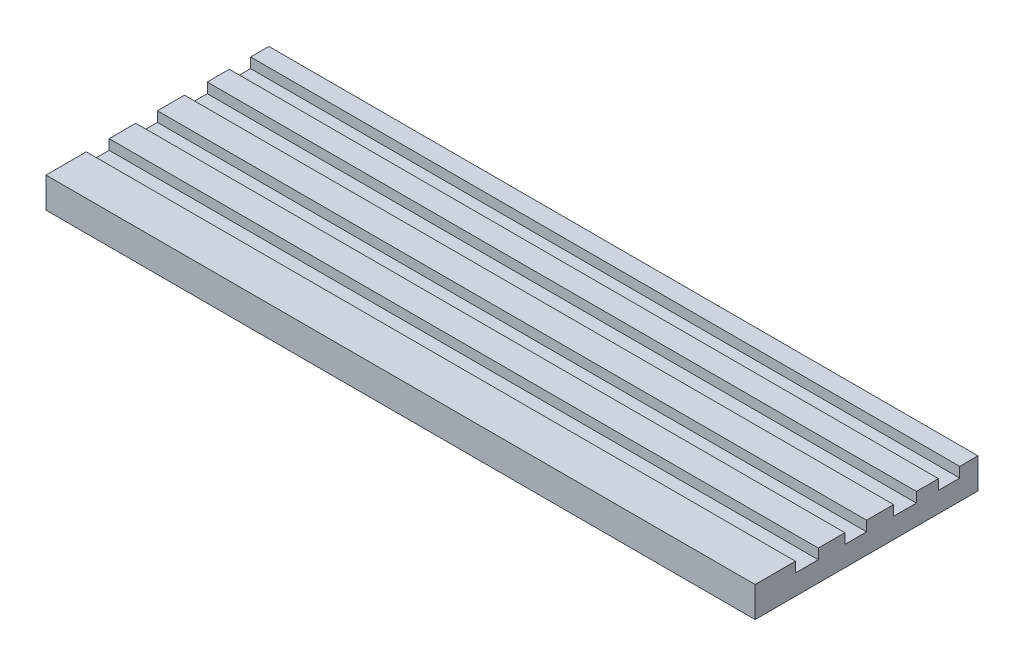
ISO-10303-21;
HEADER;
FILE_DESCRIPTION(('STEP AP214'),'2;1');
FILE_NAME('part.step','',(''),(''),'','','');
FILE_SCHEMA(('AUTOMOTIVE_DESIGN { 1 0 10303 214 1 1 1 1 }'));
ENDSEC;
DATA;
#1=APPLICATION_CONTEXT('core data for automotive mechanical design processes');
#2=APPLICATION_PROTOCOL_DEFINITION('international standard','automotive_design',2000,#1);
#3=PRODUCT_CONTEXT('',#1,'mechanical');
#4=PRODUCT('Part','Part','',(#3));
#5=PRODUCT_RELATED_PRODUCT_CATEGORY('part','',(#4));
#6=PRODUCT_DEFINITION_FORMATION('','',#4);
#7=PRODUCT_DEFINITION_CONTEXT('part definition',#1,'design');
#8=PRODUCT_DEFINITION('design','',#6,#7);
#9=PRODUCT_DEFINITION_SHAPE('','',#8);
#10=(LENGTH_UNIT() NAMED_UNIT(*) SI_UNIT(.MILLI.,.METRE.));
#11=(NAMED_UNIT(*) PLANE_ANGLE_UNIT() SI_UNIT($,.RADIAN.));
#12=(NAMED_UNIT(*) SI_UNIT($,.STERADIAN.) SOLID_ANGLE_UNIT());
#13=UNCERTAINTY_MEASURE_WITH_UNIT(LENGTH_MEASURE(1.E-05),#10,'distance_accuracy_value','');
#14=(GEOMETRIC_REPRESENTATION_CONTEXT(3) GLOBAL_UNCERTAINTY_ASSIGNED_CONTEXT((#13)) GLOBAL_UNIT_ASSIGNED_CONTEXT((#10,
#11,#12)) REPRESENTATION_CONTEXT('',''));
#15=CARTESIAN_POINT('',(0.,0.,0.));
#16=DIRECTION('',(0.,0.,1.));
#17=DIRECTION('',(1.,0.,0.));
#18=AXIS2_PLACEMENT_3D('',#15,#16,#17);
#19=CARTESIAN_POINT('',(0.,3.,0.));
#20=DIRECTION('',(0.,-1.,0.));
#21=DIRECTION('',(0.,0.,-1.));
#22=AXIS2_PLACEMENT_3D('',#19,#20,#21);
#23=PLANE('',#22);
#24=DIRECTION('',(0.,0.,1.));
#25=VECTOR('',#24,1.);
#26=CARTESIAN_POINT('',(0.,3.,0.));
#27=LINE('',#26,#25);
#28=CARTESIAN_POINT('',(0.,3.,-22.));
#29=VERTEX_POINT('',#28);
#30=CARTESIAN_POINT('',(0.,3.,-20.1975420590183));
#31=VERTEX_POINT('',#30);
#32=EDGE_CURVE('E293',#29,#31,#27,.T.);
#33=ORIENTED_EDGE('',*,*,#32,.T.);
#34=DIRECTION('',(-1.,0.,0.));
#35=VECTOR('',#34,1.);
#36=CARTESIAN_POINT('',(0.,3.,-20.1975420590183));
#37=LINE('',#36,#35);
#38=CARTESIAN_POINT('',(70.,3.,-20.1975420590183));
#39=VERTEX_POINT('',#38);
#40=EDGE_CURVE('E204',#39,#31,#37,.T.);
#41=ORIENTED_EDGE('',*,*,#40,.F.);
#42=DIRECTION('',(0.,0.,-1.));
#43=VECTOR('',#42,1.);
#44=CARTESIAN_POINT('',(70.,3.,0.));
#45=LINE('',#44,#43);
#46=CARTESIAN_POINT('',(70.,3.,-22.));
#47=VERTEX_POINT('',#46);
#48=EDGE_CURVE('E299',#39,#47,#45,.T.);
#49=ORIENTED_EDGE('',*,*,#48,.T.);
#50=DIRECTION('',(-1.,0.,0.));
#51=VECTOR('',#50,1.);
#52=CARTESIAN_POINT('',(0.,3.,-22.));
#53=LINE('',#52,#51);
#54=EDGE_CURVE('E303',#47,#29,#53,.T.);
#55=ORIENTED_EDGE('',*,*,#54,.T.);
#56=EDGE_LOOP('',(#33,#41,#49,#55));
#57=FACE_BOUND('',#56,.T.);
#58=ADVANCED_FACE('F47',(#57),#23,.F.);
#59=CARTESIAN_POINT('',(70.,3.,-15.9178694274751));
#60=VERTEX_POINT('',#59);
#61=CARTESIAN_POINT('',(70.,3.,-18.0952467312427));
#62=VERTEX_POINT('',#61);
#63=EDGE_CURVE('E346',#60,#62,#45,.T.);
#64=ORIENTED_EDGE('',*,*,#63,.T.);
#65=DIRECTION('',(1.,0.,0.));
#66=VECTOR('',#65,1.);
#67=CARTESIAN_POINT('',(0.,3.,-18.0952467312427));
#68=LINE('',#67,#66);
#69=CARTESIAN_POINT('',(0.,3.,-18.0952467312427));
#70=VERTEX_POINT('',#69);
#71=EDGE_CURVE('E235',#70,#62,#68,.T.);
#72=ORIENTED_EDGE('',*,*,#71,.F.);
#73=CARTESIAN_POINT('',(0.,3.,-15.9178694274751));
#74=VERTEX_POINT('',#73);
#75=EDGE_CURVE('E209',#70,#74,#27,.T.);
#76=ORIENTED_EDGE('',*,*,#75,.T.);
#77=DIRECTION('',(-1.,0.,0.));
#78=VECTOR('',#77,1.);
#79=CARTESIAN_POINT('',(0.,3.,-15.9178694274751));
#80=LINE('',#79,#78);
#81=EDGE_CURVE('E228',#60,#74,#80,.T.);
#82=ORIENTED_EDGE('',*,*,#81,.F.);
#83=EDGE_LOOP('',(#64,#72,#76,#82));
#84=FACE_BOUND('',#83,.T.);
#85=ADVANCED_FACE('F389',(#84),#23,.F.);
#86=CARTESIAN_POINT('',(70.,3.,-11.));
#87=VERTEX_POINT('',#86);
#88=CARTESIAN_POINT('',(70.,3.,-13.6654101477155));
#89=VERTEX_POINT('',#88);
#90=EDGE_CURVE('E348',#87,#89,#45,.T.);
#91=ORIENTED_EDGE('',*,*,#90,.T.);
#92=DIRECTION('',(1.,0.,0.));
#93=VECTOR('',#92,1.);
#94=CARTESIAN_POINT('',(0.,3.,-13.6654101477155));
#95=LINE('',#94,#93);
#96=CARTESIAN_POINT('',(0.,3.,-13.6654101477155));
#97=VERTEX_POINT('',#96);
#98=EDGE_CURVE('E231',#97,#89,#95,.T.);
#99=ORIENTED_EDGE('',*,*,#98,.F.);
#100=CARTESIAN_POINT('',(0.,3.,-11.));
#101=VERTEX_POINT('',#100);
#102=EDGE_CURVE('E375',#97,#101,#27,.T.);
#103=ORIENTED_EDGE('',*,*,#102,.T.);
#104=DIRECTION('',(-1.,0.,0.));
#105=VECTOR('',#104,1.);
#106=CARTESIAN_POINT('',(0.,3.,-11.));
#107=LINE('',#106,#105);
#108=EDGE_CURVE('E257',#87,#101,#107,.T.);
#109=ORIENTED_EDGE('',*,*,#108,.F.);
#110=EDGE_LOOP('',(#91,#99,#103,#109));
#111=FACE_BOUND('',#110,.T.);
#112=ADVANCED_FACE('F395',(#111),#23,.F.);
#113=CARTESIAN_POINT('',(70.,3.,-6.23229452450888));
#114=VERTEX_POINT('',#113);
#115=CARTESIAN_POINT('',(70.,3.,-8.8601636842284));
#116=VERTEX_POINT('',#115);
#117=EDGE_CURVE('E304',#114,#116,#45,.T.);
#118=ORIENTED_EDGE('',*,*,#117,.T.);
#119=DIRECTION('',(1.,0.,0.));
#120=VECTOR('',#119,1.);
#121=CARTESIAN_POINT('',(0.,3.,-8.8601636842284));
#122=LINE('',#121,#120);
#123=CARTESIAN_POINT('',(0.,3.,-8.8601636842284));
#124=VERTEX_POINT('',#123);
#125=EDGE_CURVE('E227',#124,#116,#122,.T.);
#126=ORIENTED_EDGE('',*,*,#125,.F.);
#127=CARTESIAN_POINT('',(0.,3.,-6.23229452450888));
#128=VERTEX_POINT('',#127);
#129=EDGE_CURVE('E373',#124,#128,#27,.T.);
#130=ORIENTED_EDGE('',*,*,#129,.T.);
#131=DIRECTION('',(-1.,0.,0.));
#132=VECTOR('',#131,1.);
#133=CARTESIAN_POINT('',(0.,3.,-6.23229452450888));
#134=LINE('',#133,#132);
#135=EDGE_CURVE('E280',#114,#128,#134,.T.);
#136=ORIENTED_EDGE('',*,*,#135,.F.);
#137=EDGE_LOOP('',(#118,#126,#130,#136));
#138=FACE_BOUND('',#137,.T.);
#139=ADVANCED_FACE('F361',(#138),#23,.F.);
#140=CARTESIAN_POINT('',(0.,3.,0.));
#141=DIRECTION('',(1.,0.,0.));
#142=DIRECTION('',(0.,0.,-1.));
#143=AXIS2_PLACEMENT_3D('',#140,#141,#142);
#144=PLANE('',#143);
#145=DIRECTION('',(0.,0.,1.));
#146=VECTOR('',#145,1.);
#147=CARTESIAN_POINT('',(0.,2.,-20.1975420590183));
#148=LINE('',#147,#146);
#149=CARTESIAN_POINT('',(0.,2.,-20.1975420590183));
#150=VERTEX_POINT('',#149);
#151=CARTESIAN_POINT('',(0.,2.,-18.0952467312427));
#152=VERTEX_POINT('',#151);
#153=EDGE_CURVE('E195',#150,#152,#148,.T.);
#154=ORIENTED_EDGE('',*,*,#153,.F.);
#155=DIRECTION('',(0.,1.,0.));
#156=VECTOR('',#155,1.);
#157=CARTESIAN_POINT('',(0.,2.,-20.1975420590183));
#158=LINE('',#157,#156);
#159=EDGE_CURVE('E312',#150,#31,#158,.T.);
#160=ORIENTED_EDGE('',*,*,#159,.T.);
#161=ORIENTED_EDGE('',*,*,#32,.F.);
#162=DIRECTION('',(0.,-1.,0.));
#163=VECTOR('',#162,1.);
#164=CARTESIAN_POINT('',(0.,3.,-22.));
#165=LINE('',#164,#163);
#166=CARTESIAN_POINT('',(0.,0.,-22.));
#167=VERTEX_POINT('',#166);
#168=EDGE_CURVE('E307',#29,#167,#165,.T.);
#169=ORIENTED_EDGE('',*,*,#168,.T.);
#170=DIRECTION('',(0.,0.,1.));
#171=VECTOR('',#170,1.);
#172=CARTESIAN_POINT('',(0.,0.,0.));
#173=LINE('',#172,#171);
#174=CARTESIAN_POINT('',(0.,0.,0.));
#175=VERTEX_POINT('',#174);
#176=EDGE_CURVE('E308',#167,#175,#173,.T.);
#177=ORIENTED_EDGE('',*,*,#176,.T.);
#178=DIRECTION('',(0.,-1.,0.));
#179=VECTOR('',#178,1.);
#180=CARTESIAN_POINT('',(0.,3.,0.));
#181=LINE('',#180,#179);
#182=CARTESIAN_POINT('',(0.,3.,0.));
#183=VERTEX_POINT('',#182);
#184=EDGE_CURVE('E11',#183,#175,#181,.T.);
#185=ORIENTED_EDGE('',*,*,#184,.F.);
#186=CARTESIAN_POINT('',(0.,3.,-3.9798352447493));
#187=VERTEX_POINT('',#186);
#188=EDGE_CURVE('E297',#187,#183,#27,.T.);
#189=ORIENTED_EDGE('',*,*,#188,.F.);
#190=DIRECTION('',(0.,1.,0.));
#191=VECTOR('',#190,1.);
#192=CARTESIAN_POINT('',(0.,2.,-3.9798352447493));
#193=LINE('',#192,#191);
#194=CARTESIAN_POINT('',(0.,2.,-3.9798352447493));
#195=VERTEX_POINT('',#194);
#196=EDGE_CURVE('E62',#195,#187,#193,.T.);
#197=ORIENTED_EDGE('',*,*,#196,.F.);
#198=DIRECTION('',(0.,0.,1.));
#199=VECTOR('',#198,1.);
#200=CARTESIAN_POINT('',(0.,2.,-6.23229452450888));
#201=LINE('',#200,#199);
#202=CARTESIAN_POINT('',(0.,2.,-6.23229452450888));
#203=VERTEX_POINT('',#202);
#204=EDGE_CURVE('E282',#203,#195,#201,.T.);
#205=ORIENTED_EDGE('',*,*,#204,.F.);
#206=DIRECTION('',(0.,1.,0.));
#207=VECTOR('',#206,1.);
#208=CARTESIAN_POINT('',(0.,2.,-6.23229452450888));
#209=LINE('',#208,#207);
#210=EDGE_CURVE('E277',#203,#128,#209,.T.);
#211=ORIENTED_EDGE('',*,*,#210,.T.);
#212=ORIENTED_EDGE('',*,*,#129,.F.);
#213=DIRECTION('',(0.,1.,0.));
#214=VECTOR('',#213,1.);
#215=CARTESIAN_POINT('',(0.,2.,-8.8601636842284));
#216=LINE('',#215,#214);
#217=CARTESIAN_POINT('',(0.,2.,-8.8601636842284));
#218=VERTEX_POINT('',#217);
#219=EDGE_CURVE('E70',#218,#124,#216,.T.);
#220=ORIENTED_EDGE('',*,*,#219,.F.);
#221=DIRECTION('',(0.,0.,1.));
#222=VECTOR('',#221,1.);
#223=CARTESIAN_POINT('',(0.,2.,-11.));
#224=LINE('',#223,#222);
#225=CARTESIAN_POINT('',(0.,2.,-11.));
#226=VERTEX_POINT('',#225);
#227=EDGE_CURVE('E259',#226,#218,#224,.T.);
#228=ORIENTED_EDGE('',*,*,#227,.F.);
#229=DIRECTION('',(0.,1.,0.));
#230=VECTOR('',#229,1.);
#231=CARTESIAN_POINT('',(0.,2.,-11.));
#232=LINE('',#231,#230);
#233=EDGE_CURVE('E253',#226,#101,#232,.T.);
#234=ORIENTED_EDGE('',*,*,#233,.T.);
#235=ORIENTED_EDGE('',*,*,#102,.F.);
#236=DIRECTION('',(0.,1.,0.));
#237=VECTOR('',#236,1.);
#238=CARTESIAN_POINT('',(0.,2.,-13.6654101477155));
#239=LINE('',#238,#237);
#240=CARTESIAN_POINT('',(0.,2.,-13.6654101477155));
#241=VERTEX_POINT('',#240);
#242=EDGE_CURVE('E217',#241,#97,#239,.T.);
#243=ORIENTED_EDGE('',*,*,#242,.F.);
#244=DIRECTION('',(0.,0.,1.));
#245=VECTOR('',#244,1.);
#246=CARTESIAN_POINT('',(0.,2.,-15.9178694274751));
#247=LINE('',#246,#245);
#248=CARTESIAN_POINT('',(0.,2.,-15.9178694274751));
#249=VERTEX_POINT('',#248);
#250=EDGE_CURVE('E232',#249,#241,#247,.T.);
#251=ORIENTED_EDGE('',*,*,#250,.F.);
#252=DIRECTION('',(0.,1.,0.));
#253=VECTOR('',#252,1.);
#254=CARTESIAN_POINT('',(0.,2.,-15.9178694274751));
#255=LINE('',#254,#253);
#256=EDGE_CURVE('E225',#249,#74,#255,.T.);
#257=ORIENTED_EDGE('',*,*,#256,.T.);
#258=ORIENTED_EDGE('',*,*,#75,.F.);
#259=DIRECTION('',(0.,1.,0.));
#260=VECTOR('',#259,1.);
#261=CARTESIAN_POINT('',(0.,2.,-18.0952467312427));
#262=LINE('',#261,#260);
#263=EDGE_CURVE('E187',#152,#70,#262,.T.);
#264=ORIENTED_EDGE('',*,*,#263,.F.);
#265=EDGE_LOOP('',(#154,#160,#161,#169,#177,#185,#189,#197,#205,#211,#212,#220,#228,#234,#235,
#243,#251,#257,#258,#264));
#266=FACE_BOUND('',#265,.T.);
#267=ADVANCED_FACE('F49',(#266),#144,.F.);
#268=CARTESIAN_POINT('',(0.,3.,0.));
#269=DIRECTION('',(0.,0.,-1.));
#270=DIRECTION('',(-1.,0.,0.));
#271=AXIS2_PLACEMENT_3D('',#268,#269,#270);
#272=PLANE('',#271);
#273=DIRECTION('',(1.,0.,0.));
#274=VECTOR('',#273,1.);
#275=CARTESIAN_POINT('',(0.,0.,0.));
#276=LINE('',#275,#274);
#277=CARTESIAN_POINT('',(70.,0.,0.));
#278=VERTEX_POINT('',#277);
#279=EDGE_CURVE('E311',#175,#278,#276,.T.);
#280=ORIENTED_EDGE('',*,*,#279,.T.);
#281=DIRECTION('',(0.,-1.,0.));
#282=VECTOR('',#281,1.);
#283=CARTESIAN_POINT('',(70.,3.,0.));
#284=LINE('',#283,#282);
#285=CARTESIAN_POINT('',(70.,3.,0.));
#286=VERTEX_POINT('',#285);
#287=EDGE_CURVE('E55',#286,#278,#284,.T.);
#288=ORIENTED_EDGE('',*,*,#287,.F.);
#289=DIRECTION('',(1.,0.,0.));
#290=VECTOR('',#289,1.);
#291=CARTESIAN_POINT('',(0.,3.,0.));
#292=LINE('',#291,#290);
#293=EDGE_CURVE('E296',#183,#286,#292,.T.);
#294=ORIENTED_EDGE('',*,*,#293,.F.);
#295=ORIENTED_EDGE('',*,*,#184,.T.);
#296=EDGE_LOOP('',(#280,#288,#294,#295));
#297=FACE_BOUND('',#296,.T.);
#298=ADVANCED_FACE('F380',(#297),#272,.F.);
#299=CARTESIAN_POINT('',(70.,3.,0.));
#300=DIRECTION('',(-1.,0.,0.));
#301=DIRECTION('',(0.,0.,1.));
#302=AXIS2_PLACEMENT_3D('',#299,#300,#301);
#303=PLANE('',#302);
#304=ORIENTED_EDGE('',*,*,#48,.F.);
#305=DIRECTION('',(0.,1.,0.));
#306=VECTOR('',#305,1.);
#307=CARTESIAN_POINT('',(70.,2.,-20.1975420590183));
#308=LINE('',#307,#306);
#309=CARTESIAN_POINT('',(70.,2.,-20.1975420590183));
#310=VERTEX_POINT('',#309);
#311=EDGE_CURVE('E211',#310,#39,#308,.T.);
#312=ORIENTED_EDGE('',*,*,#311,.F.);
#313=DIRECTION('',(0.,0.,-1.));
#314=VECTOR('',#313,1.);
#315=CARTESIAN_POINT('',(70.,2.,-20.1975420590183));
#316=LINE('',#315,#314);
#317=CARTESIAN_POINT('',(70.,2.,-18.0952467312427));
#318=VERTEX_POINT('',#317);
#319=EDGE_CURVE('E194',#318,#310,#316,.T.);
#320=ORIENTED_EDGE('',*,*,#319,.F.);
#321=DIRECTION('',(0.,1.,0.));
#322=VECTOR('',#321,1.);
#323=CARTESIAN_POINT('',(70.,2.,-18.0952467312427));
#324=LINE('',#323,#322);
#325=EDGE_CURVE('E190',#318,#62,#324,.T.);
#326=ORIENTED_EDGE('',*,*,#325,.T.);
#327=ORIENTED_EDGE('',*,*,#63,.F.);
#328=DIRECTION('',(0.,1.,0.));
#329=VECTOR('',#328,1.);
#330=CARTESIAN_POINT('',(70.,2.,-15.9178694274751));
#331=LINE('',#330,#329);
#332=CARTESIAN_POINT('',(70.,2.,-15.9178694274751));
#333=VERTEX_POINT('',#332);
#334=EDGE_CURVE('E223',#333,#60,#331,.T.);
#335=ORIENTED_EDGE('',*,*,#334,.F.);
#336=DIRECTION('',(0.,0.,-1.));
#337=VECTOR('',#336,1.);
#338=CARTESIAN_POINT('',(70.,2.,-15.9178694274751));
#339=LINE('',#338,#337);
#340=CARTESIAN_POINT('',(70.,2.,-13.6654101477155));
#341=VERTEX_POINT('',#340);
#342=EDGE_CURVE('E239',#341,#333,#339,.T.);
#343=ORIENTED_EDGE('',*,*,#342,.F.);
#344=DIRECTION('',(0.,1.,0.));
#345=VECTOR('',#344,1.);
#346=CARTESIAN_POINT('',(70.,2.,-13.6654101477155));
#347=LINE('',#346,#345);
#348=EDGE_CURVE('E220',#341,#89,#347,.T.);
#349=ORIENTED_EDGE('',*,*,#348,.T.);
#350=ORIENTED_EDGE('',*,*,#90,.F.);
#351=DIRECTION('',(0.,1.,0.));
#352=VECTOR('',#351,1.);
#353=CARTESIAN_POINT('',(70.,2.,-11.));
#354=LINE('',#353,#352);
#355=CARTESIAN_POINT('',(70.,2.,-11.));
#356=VERTEX_POINT('',#355);
#357=EDGE_CURVE('E251',#356,#87,#354,.T.);
#358=ORIENTED_EDGE('',*,*,#357,.F.);
#359=DIRECTION('',(0.,0.,-1.));
#360=VECTOR('',#359,1.);
#361=CARTESIAN_POINT('',(70.,2.,-11.));
#362=LINE('',#361,#360);
#363=CARTESIAN_POINT('',(70.,2.,-8.8601636842284));
#364=VERTEX_POINT('',#363);
#365=EDGE_CURVE('E263',#364,#356,#362,.T.);
#366=ORIENTED_EDGE('',*,*,#365,.F.);
#367=DIRECTION('',(0.,1.,0.));
#368=VECTOR('',#367,1.);
#369=CARTESIAN_POINT('',(70.,2.,-8.8601636842284));
#370=LINE('',#369,#368);
#371=EDGE_CURVE('E248',#364,#116,#370,.T.);
#372=ORIENTED_EDGE('',*,*,#371,.T.);
#373=ORIENTED_EDGE('',*,*,#117,.F.);
#374=DIRECTION('',(0.,1.,0.));
#375=VECTOR('',#374,1.);
#376=CARTESIAN_POINT('',(70.,2.,-6.23229452450888));
#377=LINE('',#376,#375);
#378=CARTESIAN_POINT('',(70.,2.,-6.23229452450888));
#379=VERTEX_POINT('',#378);
#380=EDGE_CURVE('E275',#379,#114,#377,.T.);
#381=ORIENTED_EDGE('',*,*,#380,.F.);
#382=DIRECTION('',(0.,0.,-1.));
#383=VECTOR('',#382,1.);
#384=CARTESIAN_POINT('',(70.,2.,-6.23229452450888));
#385=LINE('',#384,#383);
#386=CARTESIAN_POINT('',(70.,2.,-3.9798352447493));
#387=VERTEX_POINT('',#386);
#388=EDGE_CURVE('E286',#387,#379,#385,.T.);
#389=ORIENTED_EDGE('',*,*,#388,.F.);
#390=DIRECTION('',(0.,1.,0.));
#391=VECTOR('',#390,1.);
#392=CARTESIAN_POINT('',(70.,2.,-3.9798352447493));
#393=LINE('',#392,#391);
#394=CARTESIAN_POINT('',(70.,3.,-3.9798352447493));
#395=VERTEX_POINT('',#394);
#396=EDGE_CURVE('E272',#387,#395,#393,.T.);
#397=ORIENTED_EDGE('',*,*,#396,.T.);
#398=EDGE_CURVE('E300',#286,#395,#45,.T.);
#399=ORIENTED_EDGE('',*,*,#398,.F.);
#400=ORIENTED_EDGE('',*,*,#287,.T.);
#401=DIRECTION('',(0.,0.,-1.));
#402=VECTOR('',#401,1.);
#403=CARTESIAN_POINT('',(70.,0.,0.));
#404=LINE('',#403,#402);
#405=CARTESIAN_POINT('',(70.,0.,-22.));
#406=VERTEX_POINT('',#405);
#407=EDGE_CURVE('E314',#278,#406,#404,.T.);
#408=ORIENTED_EDGE('',*,*,#407,.T.);
#409=DIRECTION('',(0.,-1.,0.));
#410=VECTOR('',#409,1.);
#411=CARTESIAN_POINT('',(70.,3.,-22.));
#412=LINE('',#411,#410);
#413=EDGE_CURVE('E321',#47,#406,#412,.T.);
#414=ORIENTED_EDGE('',*,*,#413,.F.);
#415=EDGE_LOOP('',(#304,#312,#320,#326,#327,#335,#343,#349,#350,#358,#366,#372,#373,#381,#389,
#397,#399,#400,#408,#414));
#416=FACE_BOUND('',#415,.T.);
#417=ADVANCED_FACE('F329',(#416),#303,.F.);
#418=CARTESIAN_POINT('',(0.,3.,-22.));
#419=DIRECTION('',(0.,0.,1.));
#420=DIRECTION('',(1.,0.,0.));
#421=AXIS2_PLACEMENT_3D('',#418,#419,#420);
#422=PLANE('',#421);
#423=DIRECTION('',(-1.,0.,0.));
#424=VECTOR('',#423,1.);
#425=CARTESIAN_POINT('',(0.,0.,-22.));
#426=LINE('',#425,#424);
#427=EDGE_CURVE('E316',#406,#167,#426,.T.);
#428=ORIENTED_EDGE('',*,*,#427,.T.);
#429=ORIENTED_EDGE('',*,*,#168,.F.);
#430=ORIENTED_EDGE('',*,*,#54,.F.);
#431=ORIENTED_EDGE('',*,*,#413,.T.);
#432=EDGE_LOOP('',(#428,#429,#430,#431));
#433=FACE_BOUND('',#432,.T.);
#434=ADVANCED_FACE('F339',(#433),#422,.F.);
#435=ORIENTED_EDGE('',*,*,#398,.T.);
#436=DIRECTION('',(1.,0.,0.));
#437=VECTOR('',#436,1.);
#438=CARTESIAN_POINT('',(0.,3.,-3.9798352447493));
#439=LINE('',#438,#437);
#440=EDGE_CURVE('E256',#187,#395,#439,.T.);
#441=ORIENTED_EDGE('',*,*,#440,.F.);
#442=ORIENTED_EDGE('',*,*,#188,.T.);
#443=ORIENTED_EDGE('',*,*,#293,.T.);
#444=EDGE_LOOP('',(#435,#441,#442,#443));
#445=FACE_BOUND('',#444,.T.);
#446=ADVANCED_FACE('F379',(#445),#23,.F.);
#447=CARTESIAN_POINT('',(0.,0.,0.));
#448=DIRECTION('',(0.,-1.,0.));
#449=DIRECTION('',(0.,0.,-1.));
#450=AXIS2_PLACEMENT_3D('',#447,#448,#449);
#451=PLANE('',#450);
#452=ORIENTED_EDGE('',*,*,#176,.F.);
#453=ORIENTED_EDGE('',*,*,#427,.F.);
#454=ORIENTED_EDGE('',*,*,#407,.F.);
#455=ORIENTED_EDGE('',*,*,#279,.F.);
#456=EDGE_LOOP('',(#452,#453,#454,#455));
#457=FACE_BOUND('',#456,.T.);
#458=ADVANCED_FACE('F336',(#457),#451,.T.);
#459=CARTESIAN_POINT('',(0.,2.,-6.23229452450888));
#460=DIRECTION('',(0.,0.,-1.));
#461=DIRECTION('',(-1.,0.,0.));
#462=AXIS2_PLACEMENT_3D('',#459,#460,#461);
#463=PLANE('',#462);
#464=ORIENTED_EDGE('',*,*,#135,.T.);
#465=ORIENTED_EDGE('',*,*,#210,.F.);
#466=DIRECTION('',(-1.,0.,0.));
#467=VECTOR('',#466,1.);
#468=CARTESIAN_POINT('',(0.,2.,-6.23229452450888));
#469=LINE('',#468,#467);
#470=EDGE_CURVE('E271',#379,#203,#469,.T.);
#471=ORIENTED_EDGE('',*,*,#470,.F.);
#472=ORIENTED_EDGE('',*,*,#380,.T.);
#473=EDGE_LOOP('',(#464,#465,#471,#472));
#474=FACE_BOUND('',#473,.T.);
#475=ADVANCED_FACE('F403',(#474),#463,.F.);
#476=CARTESIAN_POINT('',(0.,2.,-3.9798352447493));
#477=DIRECTION('',(0.,0.,1.));
#478=DIRECTION('',(1.,0.,0.));
#479=AXIS2_PLACEMENT_3D('',#476,#477,#478);
#480=PLANE('',#479);
#481=ORIENTED_EDGE('',*,*,#440,.T.);
#482=ORIENTED_EDGE('',*,*,#396,.F.);
#483=DIRECTION('',(1.,0.,0.));
#484=VECTOR('',#483,1.);
#485=CARTESIAN_POINT('',(0.,2.,-3.9798352447493));
#486=LINE('',#485,#484);
#487=EDGE_CURVE('E288',#195,#387,#486,.T.);
#488=ORIENTED_EDGE('',*,*,#487,.F.);
#489=ORIENTED_EDGE('',*,*,#196,.T.);
#490=EDGE_LOOP('',(#481,#482,#488,#489));
#491=FACE_BOUND('',#490,.T.);
#492=ADVANCED_FACE('F430',(#491),#480,.F.);
#493=CARTESIAN_POINT('',(0.,2.,0.));
#494=DIRECTION('',(0.,1.,0.));
#495=DIRECTION('',(0.,0.,1.));
#496=AXIS2_PLACEMENT_3D('',#493,#494,#495);
#497=PLANE('',#496);
#498=ORIENTED_EDGE('',*,*,#204,.T.);
#499=ORIENTED_EDGE('',*,*,#487,.T.);
#500=ORIENTED_EDGE('',*,*,#388,.T.);
#501=ORIENTED_EDGE('',*,*,#470,.T.);
#502=EDGE_LOOP('',(#498,#499,#500,#501));
#503=FACE_BOUND('',#502,.T.);
#504=ADVANCED_FACE('F439',(#503),#497,.T.);
#505=CARTESIAN_POINT('',(0.,2.,-11.));
#506=DIRECTION('',(0.,0.,-1.));
#507=DIRECTION('',(-1.,0.,0.));
#508=AXIS2_PLACEMENT_3D('',#505,#506,#507);
#509=PLANE('',#508);
#510=ORIENTED_EDGE('',*,*,#108,.T.);
#511=ORIENTED_EDGE('',*,*,#233,.F.);
#512=DIRECTION('',(-1.,0.,0.));
#513=VECTOR('',#512,1.);
#514=CARTESIAN_POINT('',(0.,2.,-11.));
#515=LINE('',#514,#513);
#516=EDGE_CURVE('E247',#356,#226,#515,.T.);
#517=ORIENTED_EDGE('',*,*,#516,.F.);
#518=ORIENTED_EDGE('',*,*,#357,.T.);
#519=EDGE_LOOP('',(#510,#511,#517,#518));
#520=FACE_BOUND('',#519,.T.);
#521=ADVANCED_FACE('F447',(#520),#509,.F.);
#522=CARTESIAN_POINT('',(0.,2.,-8.8601636842284));
#523=DIRECTION('',(0.,0.,1.));
#524=DIRECTION('',(1.,0.,0.));
#525=AXIS2_PLACEMENT_3D('',#522,#523,#524);
#526=PLANE('',#525);
#527=ORIENTED_EDGE('',*,*,#125,.T.);
#528=ORIENTED_EDGE('',*,*,#371,.F.);
#529=DIRECTION('',(1.,0.,0.));
#530=VECTOR('',#529,1.);
#531=CARTESIAN_POINT('',(0.,2.,-8.8601636842284));
#532=LINE('',#531,#530);
#533=EDGE_CURVE('E265',#218,#364,#532,.T.);
#534=ORIENTED_EDGE('',*,*,#533,.F.);
#535=ORIENTED_EDGE('',*,*,#219,.T.);
#536=EDGE_LOOP('',(#527,#528,#534,#535));
#537=FACE_BOUND('',#536,.T.);
#538=ADVANCED_FACE('F368',(#537),#526,.F.);
#539=CARTESIAN_POINT('',(0.,2.,0.));
#540=DIRECTION('',(0.,1.,0.));
#541=DIRECTION('',(0.,0.,1.));
#542=AXIS2_PLACEMENT_3D('',#539,#540,#541);
#543=PLANE('',#542);
#544=ORIENTED_EDGE('',*,*,#227,.T.);
#545=ORIENTED_EDGE('',*,*,#533,.T.);
#546=ORIENTED_EDGE('',*,*,#365,.T.);
#547=ORIENTED_EDGE('',*,*,#516,.T.);
#548=EDGE_LOOP('',(#544,#545,#546,#547));
#549=FACE_BOUND('',#548,.T.);
#550=ADVANCED_FACE('F370',(#549),#543,.T.);
#551=CARTESIAN_POINT('',(0.,2.,-15.9178694274751));
#552=DIRECTION('',(0.,0.,-1.));
#553=DIRECTION('',(-1.,0.,0.));
#554=AXIS2_PLACEMENT_3D('',#551,#552,#553);
#555=PLANE('',#554);
#556=ORIENTED_EDGE('',*,*,#81,.T.);
#557=ORIENTED_EDGE('',*,*,#256,.F.);
#558=DIRECTION('',(-1.,0.,0.));
#559=VECTOR('',#558,1.);
#560=CARTESIAN_POINT('',(0.,2.,-15.9178694274751));
#561=LINE('',#560,#559);
#562=EDGE_CURVE('E219',#333,#249,#561,.T.);
#563=ORIENTED_EDGE('',*,*,#562,.F.);
#564=ORIENTED_EDGE('',*,*,#334,.T.);
#565=EDGE_LOOP('',(#556,#557,#563,#564));
#566=FACE_BOUND('',#565,.T.);
#567=ADVANCED_FACE('F470',(#566),#555,.F.);
#568=CARTESIAN_POINT('',(0.,2.,-13.6654101477155));
#569=DIRECTION('',(0.,0.,1.));
#570=DIRECTION('',(1.,0.,0.));
#571=AXIS2_PLACEMENT_3D('',#568,#569,#570);
#572=PLANE('',#571);
#573=ORIENTED_EDGE('',*,*,#98,.T.);
#574=ORIENTED_EDGE('',*,*,#348,.F.);
#575=DIRECTION('',(1.,0.,0.));
#576=VECTOR('',#575,1.);
#577=CARTESIAN_POINT('',(0.,2.,-13.6654101477155));
#578=LINE('',#577,#576);
#579=EDGE_CURVE('E241',#241,#341,#578,.T.);
#580=ORIENTED_EDGE('',*,*,#579,.F.);
#581=ORIENTED_EDGE('',*,*,#242,.T.);
#582=EDGE_LOOP('',(#573,#574,#580,#581));
#583=FACE_BOUND('',#582,.T.);
#584=ADVANCED_FACE('F478',(#583),#572,.F.);
#585=CARTESIAN_POINT('',(0.,2.,0.));
#586=DIRECTION('',(0.,1.,0.));
#587=DIRECTION('',(0.,0.,1.));
#588=AXIS2_PLACEMENT_3D('',#585,#586,#587);
#589=PLANE('',#588);
#590=ORIENTED_EDGE('',*,*,#250,.T.);
#591=ORIENTED_EDGE('',*,*,#579,.T.);
#592=ORIENTED_EDGE('',*,*,#342,.T.);
#593=ORIENTED_EDGE('',*,*,#562,.T.);
#594=EDGE_LOOP('',(#590,#591,#592,#593));
#595=FACE_BOUND('',#594,.T.);
#596=ADVANCED_FACE('F487',(#595),#589,.T.);
#597=CARTESIAN_POINT('',(0.,2.,-20.1975420590183));
#598=DIRECTION('',(0.,0.,-1.));
#599=DIRECTION('',(-1.,0.,0.));
#600=AXIS2_PLACEMENT_3D('',#597,#598,#599);
#601=PLANE('',#600);
#602=ORIENTED_EDGE('',*,*,#40,.T.);
#603=ORIENTED_EDGE('',*,*,#159,.F.);
#604=DIRECTION('',(-1.,0.,0.));
#605=VECTOR('',#604,1.);
#606=CARTESIAN_POINT('',(0.,2.,-20.1975420590183));
#607=LINE('',#606,#605);
#608=EDGE_CURVE('E201',#310,#150,#607,.T.);
#609=ORIENTED_EDGE('',*,*,#608,.F.);
#610=ORIENTED_EDGE('',*,*,#311,.T.);
#611=EDGE_LOOP('',(#602,#603,#609,#610));
#612=FACE_BOUND('',#611,.T.);
#613=ADVANCED_FACE('F496',(#612),#601,.F.);
#614=CARTESIAN_POINT('',(0.,2.,-18.0952467312427));
#615=DIRECTION('',(0.,0.,1.));
#616=DIRECTION('',(1.,0.,0.));
#617=AXIS2_PLACEMENT_3D('',#614,#615,#616);
#618=PLANE('',#617);
#619=ORIENTED_EDGE('',*,*,#71,.T.);
#620=ORIENTED_EDGE('',*,*,#325,.F.);
#621=DIRECTION('',(1.,0.,0.));
#622=VECTOR('',#621,1.);
#623=CARTESIAN_POINT('',(0.,2.,-18.0952467312427));
#624=LINE('',#623,#622);
#625=EDGE_CURVE('E183',#152,#318,#624,.T.);
#626=ORIENTED_EDGE('',*,*,#625,.F.);
#627=ORIENTED_EDGE('',*,*,#263,.T.);
#628=EDGE_LOOP('',(#619,#620,#626,#627));
#629=FACE_BOUND('',#628,.T.);
#630=ADVANCED_FACE('F185',(#629),#618,.F.);
#631=CARTESIAN_POINT('',(0.,2.,0.));
#632=DIRECTION('',(0.,1.,0.));
#633=DIRECTION('',(0.,0.,1.));
#634=AXIS2_PLACEMENT_3D('',#631,#632,#633);
#635=PLANE('',#634);
#636=ORIENTED_EDGE('',*,*,#153,.T.);
#637=ORIENTED_EDGE('',*,*,#625,.T.);
#638=ORIENTED_EDGE('',*,*,#319,.T.);
#639=ORIENTED_EDGE('',*,*,#608,.T.);
#640=EDGE_LOOP('',(#636,#637,#638,#639));
#641=FACE_BOUND('',#640,.T.);
#642=ADVANCED_FACE('F199',(#641),#635,.T.);
#643=CLOSED_SHELL('',(#58,#85,#112,#139,#267,#298,#417,#434,#446,#458,#475,#492,#504,#521,#538,
#550,#567,#584,#596,#613,#630,#642));
#644=MANIFOLD_SOLID_BREP('B2',#643);
#645=ADVANCED_BREP_SHAPE_REPRESENTATION('',(#18,#644),#14);
#646=SHAPE_DEFINITION_REPRESENTATION(#9,#645);
ENDSEC;
END-ISO-10303-21;
